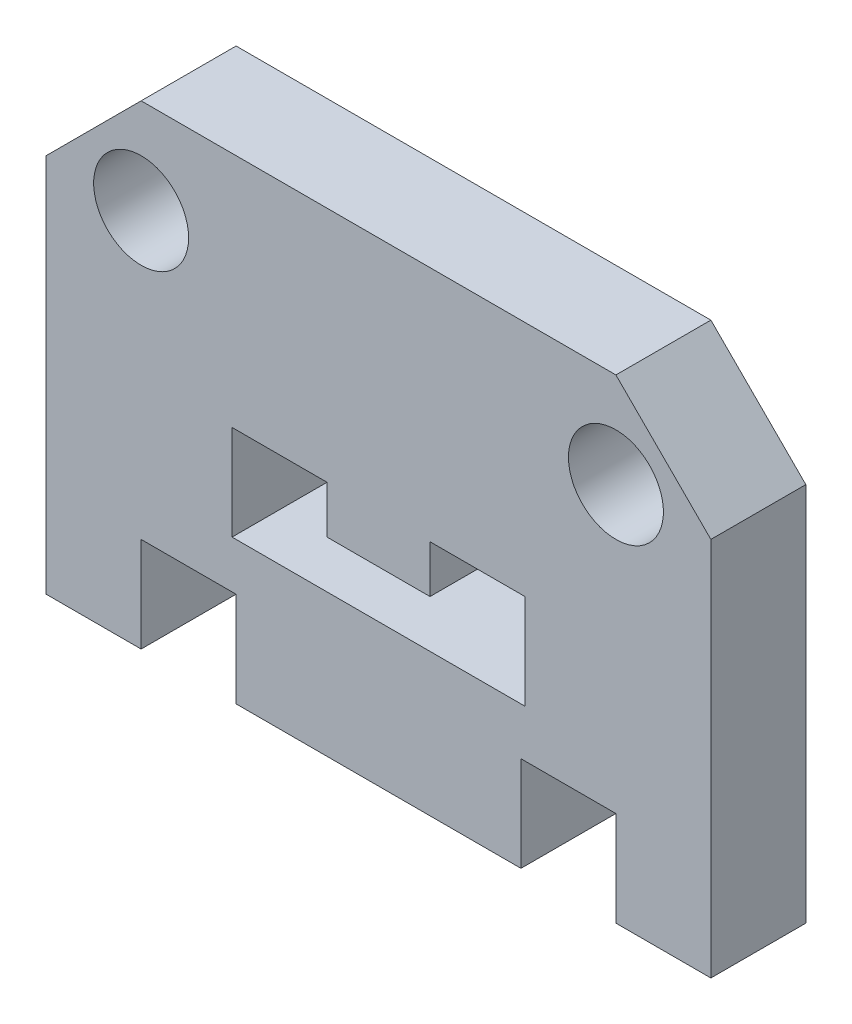
ISO-10303-21;
HEADER;
FILE_DESCRIPTION(('STEP AP214'),'2;1');
FILE_NAME('part.step','',(''),(''),'','','');
FILE_SCHEMA(('AUTOMOTIVE_DESIGN { 1 0 10303 214 1 1 1 1 }'));
ENDSEC;
DATA;
#1=APPLICATION_CONTEXT('core data for automotive mechanical design processes');
#2=APPLICATION_PROTOCOL_DEFINITION('international standard','automotive_design',2000,#1);
#3=PRODUCT_CONTEXT('',#1,'mechanical');
#4=PRODUCT('Part','Part','',(#3));
#5=PRODUCT_RELATED_PRODUCT_CATEGORY('part','',(#4));
#6=PRODUCT_DEFINITION_FORMATION('','',#4);
#7=PRODUCT_DEFINITION_CONTEXT('part definition',#1,'design');
#8=PRODUCT_DEFINITION('design','',#6,#7);
#9=PRODUCT_DEFINITION_SHAPE('','',#8);
#10=(LENGTH_UNIT() NAMED_UNIT(*) SI_UNIT(.MILLI.,.METRE.));
#11=(NAMED_UNIT(*) PLANE_ANGLE_UNIT() SI_UNIT($,.RADIAN.));
#12=(NAMED_UNIT(*) SI_UNIT($,.STERADIAN.) SOLID_ANGLE_UNIT());
#13=UNCERTAINTY_MEASURE_WITH_UNIT(LENGTH_MEASURE(1.E-05),#10,'distance_accuracy_value','');
#14=(GEOMETRIC_REPRESENTATION_CONTEXT(3) GLOBAL_UNCERTAINTY_ASSIGNED_CONTEXT((#13)) GLOBAL_UNIT_ASSIGNED_CONTEXT((#10,
#11,#12)) REPRESENTATION_CONTEXT('',''));
#15=CARTESIAN_POINT('',(0.,0.,0.));
#16=DIRECTION('',(0.,0.,1.));
#17=DIRECTION('',(1.,0.,0.));
#18=AXIS2_PLACEMENT_3D('',#15,#16,#17);
#19=CARTESIAN_POINT('',(0.,0.,10.));
#20=DIRECTION('',(0.,0.,1.));
#21=DIRECTION('',(1.,0.,0.));
#22=AXIS2_PLACEMENT_3D('',#19,#20,#21);
#23=PLANE('',#22);
#24=CARTESIAN_POINT('',(-25.,2.14457831325306,10.));
#25=DIRECTION('',(0.,0.,1.));
#26=DIRECTION('',(1.,0.,0.));
#27=AXIS2_PLACEMENT_3D('',#24,#25,#26);
#28=CIRCLE('',#27,5.);
#29=CARTESIAN_POINT('',(-20.,2.14457831325306,10.));
#30=VERTEX_POINT('',#29);
#31=EDGE_CURVE('E241',#30,#30,#28,.T.);
#32=ORIENTED_EDGE('',*,*,#31,.F.);
#33=EDGE_LOOP('',(#32));
#34=FACE_BOUND('',#33,.T.);
#35=DIRECTION('',(-0.707106781186548,-0.707106781186547,0.));
#36=VECTOR('',#35,1.);
#37=CARTESIAN_POINT('',(-25.,12.144578313253,10.));
#38=LINE('',#37,#36);
#39=CARTESIAN_POINT('',(-25.,12.144578313253,10.));
#40=VERTEX_POINT('',#39);
#41=CARTESIAN_POINT('',(-35.,2.14457831325301,10.));
#42=VERTEX_POINT('',#41);
#43=EDGE_CURVE('E285',#40,#42,#38,.T.);
#44=ORIENTED_EDGE('',*,*,#43,.T.);
#45=DIRECTION('',(0.,-1.,0.));
#46=VECTOR('',#45,1.);
#47=CARTESIAN_POINT('',(-35.,2.14457831325301,10.));
#48=LINE('',#47,#46);
#49=CARTESIAN_POINT('',(-35.,-37.855421686747,10.));
#50=VERTEX_POINT('',#49);
#51=EDGE_CURVE('E289',#42,#50,#48,.T.);
#52=ORIENTED_EDGE('',*,*,#51,.T.);
#53=DIRECTION('',(1.,0.,0.));
#54=VECTOR('',#53,1.);
#55=CARTESIAN_POINT('',(-35.,-37.855421686747,10.));
#56=LINE('',#55,#54);
#57=CARTESIAN_POINT('',(-25.,-37.855421686747,10.));
#58=VERTEX_POINT('',#57);
#59=EDGE_CURVE('E293',#50,#58,#56,.T.);
#60=ORIENTED_EDGE('',*,*,#59,.T.);
#61=DIRECTION('',(0.,1.,0.));
#62=VECTOR('',#61,1.);
#63=CARTESIAN_POINT('',(-25.,-37.855421686747,10.));
#64=LINE('',#63,#62);
#65=CARTESIAN_POINT('',(-25.,-27.855421686747,10.));
#66=VERTEX_POINT('',#65);
#67=EDGE_CURVE('E296',#58,#66,#64,.T.);
#68=ORIENTED_EDGE('',*,*,#67,.T.);
#69=DIRECTION('',(1.,0.,0.));
#70=VECTOR('',#69,1.);
#71=CARTESIAN_POINT('',(-25.,-27.855421686747,10.));
#72=LINE('',#71,#70);
#73=CARTESIAN_POINT('',(-15.,-27.855421686747,10.));
#74=VERTEX_POINT('',#73);
#75=EDGE_CURVE('E299',#66,#74,#72,.T.);
#76=ORIENTED_EDGE('',*,*,#75,.T.);
#77=DIRECTION('',(0.,-1.,0.));
#78=VECTOR('',#77,1.);
#79=CARTESIAN_POINT('',(-15.,-27.855421686747,10.));
#80=LINE('',#79,#78);
#81=CARTESIAN_POINT('',(-15.,-37.855421686747,10.));
#82=VERTEX_POINT('',#81);
#83=EDGE_CURVE('E302',#74,#82,#80,.T.);
#84=ORIENTED_EDGE('',*,*,#83,.T.);
#85=DIRECTION('',(1.,0.,0.));
#86=VECTOR('',#85,1.);
#87=CARTESIAN_POINT('',(-15.,-37.855421686747,10.));
#88=LINE('',#87,#86);
#89=CARTESIAN_POINT('',(15.,-37.855421686747,10.));
#90=VERTEX_POINT('',#89);
#91=EDGE_CURVE('E305',#82,#90,#88,.T.);
#92=ORIENTED_EDGE('',*,*,#91,.T.);
#93=DIRECTION('',(0.,1.,0.));
#94=VECTOR('',#93,1.);
#95=CARTESIAN_POINT('',(15.,-27.855421686747,10.));
#96=LINE('',#95,#94);
#97=CARTESIAN_POINT('',(15.,-27.855421686747,10.));
#98=VERTEX_POINT('',#97);
#99=EDGE_CURVE('E308',#90,#98,#96,.T.);
#100=ORIENTED_EDGE('',*,*,#99,.T.);
#101=DIRECTION('',(1.,0.,0.));
#102=VECTOR('',#101,1.);
#103=CARTESIAN_POINT('',(25.,-27.855421686747,10.));
#104=LINE('',#103,#102);
#105=CARTESIAN_POINT('',(25.,-27.855421686747,10.));
#106=VERTEX_POINT('',#105);
#107=EDGE_CURVE('E311',#98,#106,#104,.T.);
#108=ORIENTED_EDGE('',*,*,#107,.T.);
#109=DIRECTION('',(0.,-1.,0.));
#110=VECTOR('',#109,1.);
#111=CARTESIAN_POINT('',(25.,-37.855421686747,10.));
#112=LINE('',#111,#110);
#113=CARTESIAN_POINT('',(25.,-37.855421686747,10.));
#114=VERTEX_POINT('',#113);
#115=EDGE_CURVE('E314',#106,#114,#112,.T.);
#116=ORIENTED_EDGE('',*,*,#115,.T.);
#117=DIRECTION('',(1.,0.,0.));
#118=VECTOR('',#117,1.);
#119=CARTESIAN_POINT('',(35.,-37.855421686747,10.));
#120=LINE('',#119,#118);
#121=CARTESIAN_POINT('',(35.,-37.855421686747,10.));
#122=VERTEX_POINT('',#121);
#123=EDGE_CURVE('E317',#114,#122,#120,.T.);
#124=ORIENTED_EDGE('',*,*,#123,.T.);
#125=DIRECTION('',(0.,1.,0.));
#126=VECTOR('',#125,1.);
#127=CARTESIAN_POINT('',(35.,2.14457831325302,10.));
#128=LINE('',#127,#126);
#129=CARTESIAN_POINT('',(35.,2.14457831325302,10.));
#130=VERTEX_POINT('',#129);
#131=EDGE_CURVE('E320',#122,#130,#128,.T.);
#132=ORIENTED_EDGE('',*,*,#131,.T.);
#133=DIRECTION('',(-0.707106781186548,0.707106781186547,0.));
#134=VECTOR('',#133,1.);
#135=CARTESIAN_POINT('',(25.,12.144578313253,10.));
#136=LINE('',#135,#134);
#137=CARTESIAN_POINT('',(25.,12.144578313253,10.));
#138=VERTEX_POINT('',#137);
#139=EDGE_CURVE('E323',#130,#138,#136,.T.);
#140=ORIENTED_EDGE('',*,*,#139,.T.);
#141=DIRECTION('',(-1.,0.,0.));
#142=VECTOR('',#141,1.);
#143=CARTESIAN_POINT('',(25.,12.144578313253,10.));
#144=LINE('',#143,#142);
#145=EDGE_CURVE('E326',#138,#40,#144,.T.);
#146=ORIENTED_EDGE('',*,*,#145,.T.);
#147=EDGE_LOOP('',(#44,#52,#60,#68,#76,#84,#92,#100,#108,#116,#124,#132,#140,#146));
#148=FACE_BOUND('',#147,.T.);
#149=DIRECTION('',(0.,-1.,0.));
#150=VECTOR('',#149,1.);
#151=CARTESIAN_POINT('',(5.42168674698795,-17.855421686747,10.));
#152=LINE('',#151,#150);
#153=CARTESIAN_POINT('',(5.42168674698795,-12.855421686747,10.));
#154=VERTEX_POINT('',#153);
#155=CARTESIAN_POINT('',(5.42168674698795,-17.855421686747,10.));
#156=VERTEX_POINT('',#155);
#157=EDGE_CURVE('E202',#154,#156,#152,.T.);
#158=ORIENTED_EDGE('',*,*,#157,.F.);
#159=DIRECTION('',(-1.,0.,0.));
#160=VECTOR('',#159,1.);
#161=CARTESIAN_POINT('',(5.42168674698795,-12.855421686747,10.));
#162=LINE('',#161,#160);
#163=CARTESIAN_POINT('',(15.4216867469879,-12.855421686747,10.));
#164=VERTEX_POINT('',#163);
#165=EDGE_CURVE('E193',#164,#154,#162,.T.);
#166=ORIENTED_EDGE('',*,*,#165,.F.);
#167=DIRECTION('',(0.,1.,0.));
#168=VECTOR('',#167,1.);
#169=CARTESIAN_POINT('',(15.4216867469879,-12.855421686747,10.));
#170=LINE('',#169,#168);
#171=CARTESIAN_POINT('',(15.4216867469879,-22.855421686747,10.));
#172=VERTEX_POINT('',#171);
#173=EDGE_CURVE('E236',#172,#164,#170,.T.);
#174=ORIENTED_EDGE('',*,*,#173,.F.);
#175=DIRECTION('',(1.,0.,0.));
#176=VECTOR('',#175,1.);
#177=CARTESIAN_POINT('',(-15.4216867469879,-22.855421686747,10.));
#178=LINE('',#177,#176);
#179=CARTESIAN_POINT('',(-15.4216867469879,-22.855421686747,10.));
#180=VERTEX_POINT('',#179);
#181=EDGE_CURVE('E233',#180,#172,#178,.T.);
#182=ORIENTED_EDGE('',*,*,#181,.F.);
#183=DIRECTION('',(0.,-1.,0.));
#184=VECTOR('',#183,1.);
#185=CARTESIAN_POINT('',(-15.4216867469879,-12.855421686747,10.));
#186=LINE('',#185,#184);
#187=CARTESIAN_POINT('',(-15.4216867469879,-12.855421686747,10.));
#188=VERTEX_POINT('',#187);
#189=EDGE_CURVE('E230',#188,#180,#186,.T.);
#190=ORIENTED_EDGE('',*,*,#189,.F.);
#191=DIRECTION('',(-1.,0.,0.));
#192=VECTOR('',#191,1.);
#193=CARTESIAN_POINT('',(-5.42168674698794,-12.855421686747,10.));
#194=LINE('',#193,#192);
#195=CARTESIAN_POINT('',(-5.42168674698794,-12.855421686747,10.));
#196=VERTEX_POINT('',#195);
#197=EDGE_CURVE('E227',#196,#188,#194,.T.);
#198=ORIENTED_EDGE('',*,*,#197,.F.);
#199=DIRECTION('',(0.,1.,0.));
#200=VECTOR('',#199,1.);
#201=CARTESIAN_POINT('',(-5.42168674698794,-17.855421686747,10.));
#202=LINE('',#201,#200);
#203=CARTESIAN_POINT('',(-5.42168674698794,-17.855421686747,10.));
#204=VERTEX_POINT('',#203);
#205=EDGE_CURVE('E221',#204,#196,#202,.T.);
#206=ORIENTED_EDGE('',*,*,#205,.F.);
#207=DIRECTION('',(-1.,0.,0.));
#208=VECTOR('',#207,1.);
#209=CARTESIAN_POINT('',(5.42168674698795,-17.855421686747,10.));
#210=LINE('',#209,#208);
#211=EDGE_CURVE('E217',#156,#204,#210,.T.);
#212=ORIENTED_EDGE('',*,*,#211,.F.);
#213=EDGE_LOOP('',(#158,#166,#174,#182,#190,#198,#206,#212));
#214=FACE_BOUND('',#213,.T.);
#215=CARTESIAN_POINT('',(25.,2.14457831325307,10.));
#216=DIRECTION('',(0.,0.,1.));
#217=DIRECTION('',(-1.,0.,0.));
#218=AXIS2_PLACEMENT_3D('',#215,#216,#217);
#219=CIRCLE('',#218,5.);
#220=CARTESIAN_POINT('',(20.,2.14457831325307,10.));
#221=VERTEX_POINT('',#220);
#222=EDGE_CURVE('E768',#221,#221,#219,.T.);
#223=ORIENTED_EDGE('',*,*,#222,.F.);
#224=EDGE_LOOP('',(#223));
#225=FACE_BOUND('',#224,.T.);
#226=ADVANCED_FACE('F43',(#34,#148,#214,#225),#23,.T.);
#227=CARTESIAN_POINT('',(0.,0.,0.));
#228=DIRECTION('',(0.,0.,1.));
#229=DIRECTION('',(1.,0.,0.));
#230=AXIS2_PLACEMENT_3D('',#227,#228,#229);
#231=PLANE('',#230);
#232=DIRECTION('',(-0.707106781186548,-0.707106781186547,0.));
#233=VECTOR('',#232,1.);
#234=CARTESIAN_POINT('',(-25.,12.144578313253,0.));
#235=LINE('',#234,#233);
#236=CARTESIAN_POINT('',(-25.,12.144578313253,0.));
#237=VERTEX_POINT('',#236);
#238=CARTESIAN_POINT('',(-35.,2.14457831325301,0.));
#239=VERTEX_POINT('',#238);
#240=EDGE_CURVE('E211',#237,#239,#235,.T.);
#241=ORIENTED_EDGE('',*,*,#240,.F.);
#242=DIRECTION('',(-1.,0.,0.));
#243=VECTOR('',#242,1.);
#244=CARTESIAN_POINT('',(25.,12.144578313253,0.));
#245=LINE('',#244,#243);
#246=CARTESIAN_POINT('',(25.,12.144578313253,0.));
#247=VERTEX_POINT('',#246);
#248=EDGE_CURVE('E290',#247,#237,#245,.T.);
#249=ORIENTED_EDGE('',*,*,#248,.F.);
#250=DIRECTION('',(-0.707106781186548,0.707106781186547,0.));
#251=VECTOR('',#250,1.);
#252=CARTESIAN_POINT('',(25.,12.144578313253,0.));
#253=LINE('',#252,#251);
#254=CARTESIAN_POINT('',(35.,2.14457831325302,0.));
#255=VERTEX_POINT('',#254);
#256=EDGE_CURVE('E366',#255,#247,#253,.T.);
#257=ORIENTED_EDGE('',*,*,#256,.F.);
#258=DIRECTION('',(0.,1.,0.));
#259=VECTOR('',#258,1.);
#260=CARTESIAN_POINT('',(35.,2.14457831325302,0.));
#261=LINE('',#260,#259);
#262=CARTESIAN_POINT('',(35.,-37.855421686747,0.));
#263=VERTEX_POINT('',#262);
#264=EDGE_CURVE('E363',#263,#255,#261,.T.);
#265=ORIENTED_EDGE('',*,*,#264,.F.);
#266=DIRECTION('',(1.,0.,0.));
#267=VECTOR('',#266,1.);
#268=CARTESIAN_POINT('',(35.,-37.855421686747,0.));
#269=LINE('',#268,#267);
#270=CARTESIAN_POINT('',(25.,-37.855421686747,0.));
#271=VERTEX_POINT('',#270);
#272=EDGE_CURVE('E360',#271,#263,#269,.T.);
#273=ORIENTED_EDGE('',*,*,#272,.F.);
#274=DIRECTION('',(0.,-1.,0.));
#275=VECTOR('',#274,1.);
#276=CARTESIAN_POINT('',(25.,-37.855421686747,0.));
#277=LINE('',#276,#275);
#278=CARTESIAN_POINT('',(25.,-27.855421686747,0.));
#279=VERTEX_POINT('',#278);
#280=EDGE_CURVE('E357',#279,#271,#277,.T.);
#281=ORIENTED_EDGE('',*,*,#280,.F.);
#282=DIRECTION('',(1.,0.,0.));
#283=VECTOR('',#282,1.);
#284=CARTESIAN_POINT('',(25.,-27.855421686747,0.));
#285=LINE('',#284,#283);
#286=CARTESIAN_POINT('',(15.,-27.855421686747,0.));
#287=VERTEX_POINT('',#286);
#288=EDGE_CURVE('E354',#287,#279,#285,.T.);
#289=ORIENTED_EDGE('',*,*,#288,.F.);
#290=DIRECTION('',(0.,1.,0.));
#291=VECTOR('',#290,1.);
#292=CARTESIAN_POINT('',(15.,-27.855421686747,0.));
#293=LINE('',#292,#291);
#294=CARTESIAN_POINT('',(15.,-37.855421686747,0.));
#295=VERTEX_POINT('',#294);
#296=EDGE_CURVE('E351',#295,#287,#293,.T.);
#297=ORIENTED_EDGE('',*,*,#296,.F.);
#298=DIRECTION('',(1.,0.,0.));
#299=VECTOR('',#298,1.);
#300=CARTESIAN_POINT('',(-15.,-37.855421686747,0.));
#301=LINE('',#300,#299);
#302=CARTESIAN_POINT('',(-15.,-37.855421686747,0.));
#303=VERTEX_POINT('',#302);
#304=EDGE_CURVE('E348',#303,#295,#301,.T.);
#305=ORIENTED_EDGE('',*,*,#304,.F.);
#306=DIRECTION('',(0.,-1.,0.));
#307=VECTOR('',#306,1.);
#308=CARTESIAN_POINT('',(-15.,-27.855421686747,0.));
#309=LINE('',#308,#307);
#310=CARTESIAN_POINT('',(-15.,-27.855421686747,0.));
#311=VERTEX_POINT('',#310);
#312=EDGE_CURVE('E345',#311,#303,#309,.T.);
#313=ORIENTED_EDGE('',*,*,#312,.F.);
#314=DIRECTION('',(1.,0.,0.));
#315=VECTOR('',#314,1.);
#316=CARTESIAN_POINT('',(-25.,-27.855421686747,0.));
#317=LINE('',#316,#315);
#318=CARTESIAN_POINT('',(-25.,-27.855421686747,0.));
#319=VERTEX_POINT('',#318);
#320=EDGE_CURVE('E342',#319,#311,#317,.T.);
#321=ORIENTED_EDGE('',*,*,#320,.F.);
#322=DIRECTION('',(0.,1.,0.));
#323=VECTOR('',#322,1.);
#324=CARTESIAN_POINT('',(-25.,-37.855421686747,0.));
#325=LINE('',#324,#323);
#326=CARTESIAN_POINT('',(-25.,-37.855421686747,0.));
#327=VERTEX_POINT('',#326);
#328=EDGE_CURVE('E339',#327,#319,#325,.T.);
#329=ORIENTED_EDGE('',*,*,#328,.F.);
#330=DIRECTION('',(1.,0.,0.));
#331=VECTOR('',#330,1.);
#332=CARTESIAN_POINT('',(-35.,-37.855421686747,0.));
#333=LINE('',#332,#331);
#334=CARTESIAN_POINT('',(-35.,-37.855421686747,0.));
#335=VERTEX_POINT('',#334);
#336=EDGE_CURVE('E336',#335,#327,#333,.T.);
#337=ORIENTED_EDGE('',*,*,#336,.F.);
#338=DIRECTION('',(0.,-1.,0.));
#339=VECTOR('',#338,1.);
#340=CARTESIAN_POINT('',(-35.,2.14457831325301,0.));
#341=LINE('',#340,#339);
#342=EDGE_CURVE('E333',#239,#335,#341,.T.);
#343=ORIENTED_EDGE('',*,*,#342,.F.);
#344=EDGE_LOOP('',(#241,#249,#257,#265,#273,#281,#289,#297,#305,#313,#321,#329,#337,#343));
#345=FACE_BOUND('',#344,.T.);
#346=DIRECTION('',(-1.,0.,0.));
#347=VECTOR('',#346,1.);
#348=CARTESIAN_POINT('',(5.42168674698795,-12.855421686747,0.));
#349=LINE('',#348,#347);
#350=CARTESIAN_POINT('',(15.4216867469879,-12.855421686747,0.));
#351=VERTEX_POINT('',#350);
#352=CARTESIAN_POINT('',(5.42168674698795,-12.855421686747,0.));
#353=VERTEX_POINT('',#352);
#354=EDGE_CURVE('E67',#351,#353,#349,.T.);
#355=ORIENTED_EDGE('',*,*,#354,.T.);
#356=DIRECTION('',(0.,-1.,0.));
#357=VECTOR('',#356,1.);
#358=CARTESIAN_POINT('',(5.42168674698795,-17.855421686747,0.));
#359=LINE('',#358,#357);
#360=CARTESIAN_POINT('',(5.42168674698795,-17.855421686747,0.));
#361=VERTEX_POINT('',#360);
#362=EDGE_CURVE('E209',#353,#361,#359,.T.);
#363=ORIENTED_EDGE('',*,*,#362,.T.);
#364=DIRECTION('',(-1.,0.,0.));
#365=VECTOR('',#364,1.);
#366=CARTESIAN_POINT('',(5.42168674698795,-17.855421686747,0.));
#367=LINE('',#366,#365);
#368=CARTESIAN_POINT('',(-5.42168674698794,-17.855421686747,0.));
#369=VERTEX_POINT('',#368);
#370=EDGE_CURVE('E244',#361,#369,#367,.T.);
#371=ORIENTED_EDGE('',*,*,#370,.T.);
#372=DIRECTION('',(0.,1.,0.));
#373=VECTOR('',#372,1.);
#374=CARTESIAN_POINT('',(-5.42168674698794,-17.855421686747,0.));
#375=LINE('',#374,#373);
#376=CARTESIAN_POINT('',(-5.42168674698794,-12.855421686747,0.));
#377=VERTEX_POINT('',#376);
#378=EDGE_CURVE('E248',#369,#377,#375,.T.);
#379=ORIENTED_EDGE('',*,*,#378,.T.);
#380=DIRECTION('',(-1.,0.,0.));
#381=VECTOR('',#380,1.);
#382=CARTESIAN_POINT('',(-5.42168674698794,-12.855421686747,0.));
#383=LINE('',#382,#381);
#384=CARTESIAN_POINT('',(-15.4216867469879,-12.855421686747,0.));
#385=VERTEX_POINT('',#384);
#386=EDGE_CURVE('E252',#377,#385,#383,.T.);
#387=ORIENTED_EDGE('',*,*,#386,.T.);
#388=DIRECTION('',(0.,-1.,0.));
#389=VECTOR('',#388,1.);
#390=CARTESIAN_POINT('',(-15.4216867469879,-12.855421686747,0.));
#391=LINE('',#390,#389);
#392=CARTESIAN_POINT('',(-15.4216867469879,-22.855421686747,0.));
#393=VERTEX_POINT('',#392);
#394=EDGE_CURVE('E256',#385,#393,#391,.T.);
#395=ORIENTED_EDGE('',*,*,#394,.T.);
#396=DIRECTION('',(1.,0.,0.));
#397=VECTOR('',#396,1.);
#398=CARTESIAN_POINT('',(-15.4216867469879,-22.855421686747,0.));
#399=LINE('',#398,#397);
#400=CARTESIAN_POINT('',(15.4216867469879,-22.855421686747,0.));
#401=VERTEX_POINT('',#400);
#402=EDGE_CURVE('E260',#393,#401,#399,.T.);
#403=ORIENTED_EDGE('',*,*,#402,.T.);
#404=DIRECTION('',(0.,1.,0.));
#405=VECTOR('',#404,1.);
#406=CARTESIAN_POINT('',(15.4216867469879,-12.855421686747,0.));
#407=LINE('',#406,#405);
#408=EDGE_CURVE('E203',#401,#351,#407,.T.);
#409=ORIENTED_EDGE('',*,*,#408,.T.);
#410=EDGE_LOOP('',(#355,#363,#371,#379,#387,#395,#403,#409));
#411=FACE_BOUND('',#410,.T.);
#412=CARTESIAN_POINT('',(-25.,2.14457831325306,0.));
#413=DIRECTION('',(0.,0.,1.));
#414=DIRECTION('',(1.,0.,0.));
#415=AXIS2_PLACEMENT_3D('',#412,#413,#414);
#416=CIRCLE('',#415,5.);
#417=CARTESIAN_POINT('',(-20.,2.14457831325306,0.));
#418=VERTEX_POINT('',#417);
#419=EDGE_CURVE('E776',#418,#418,#416,.T.);
#420=ORIENTED_EDGE('',*,*,#419,.T.);
#421=EDGE_LOOP('',(#420));
#422=FACE_BOUND('',#421,.T.);
#423=CARTESIAN_POINT('',(25.,2.14457831325307,0.));
#424=DIRECTION('',(0.,0.,1.));
#425=DIRECTION('',(-1.,0.,0.));
#426=AXIS2_PLACEMENT_3D('',#423,#424,#425);
#427=CIRCLE('',#426,5.);
#428=CARTESIAN_POINT('',(20.,2.14457831325307,0.));
#429=VERTEX_POINT('',#428);
#430=EDGE_CURVE('E771',#429,#429,#427,.T.);
#431=ORIENTED_EDGE('',*,*,#430,.T.);
#432=EDGE_LOOP('',(#431));
#433=FACE_BOUND('',#432,.T.);
#434=ADVANCED_FACE('F429',(#345,#411,#422,#433),#231,.F.);
#435=CARTESIAN_POINT('',(-25.,12.144578313253,10.));
#436=DIRECTION('',(0.707106781186547,-0.707106781186548,0.));
#437=DIRECTION('',(0.707106781186548,0.707106781186547,0.));
#438=AXIS2_PLACEMENT_3D('',#435,#436,#437);
#439=PLANE('',#438);
#440=ORIENTED_EDGE('',*,*,#240,.T.);
#441=DIRECTION('',(0.,0.,-1.));
#442=VECTOR('',#441,1.);
#443=CARTESIAN_POINT('',(-35.,2.14457831325301,10.));
#444=LINE('',#443,#442);
#445=EDGE_CURVE('E11',#42,#239,#444,.T.);
#446=ORIENTED_EDGE('',*,*,#445,.F.);
#447=ORIENTED_EDGE('',*,*,#43,.F.);
#448=DIRECTION('',(0.,0.,-1.));
#449=VECTOR('',#448,1.);
#450=CARTESIAN_POINT('',(-25.,12.144578313253,10.));
#451=LINE('',#450,#449);
#452=EDGE_CURVE('E329',#40,#237,#451,.T.);
#453=ORIENTED_EDGE('',*,*,#452,.T.);
#454=EDGE_LOOP('',(#440,#446,#447,#453));
#455=FACE_BOUND('',#454,.T.);
#456=ADVANCED_FACE('F45',(#455),#439,.F.);
#457=CARTESIAN_POINT('',(-35.,2.14457831325301,10.));
#458=DIRECTION('',(1.,0.,0.));
#459=DIRECTION('',(0.,0.,-1.));
#460=AXIS2_PLACEMENT_3D('',#457,#458,#459);
#461=PLANE('',#460);
#462=ORIENTED_EDGE('',*,*,#342,.T.);
#463=DIRECTION('',(0.,0.,-1.));
#464=VECTOR('',#463,1.);
#465=CARTESIAN_POINT('',(-35.,-37.855421686747,10.));
#466=LINE('',#465,#464);
#467=EDGE_CURVE('E52',#50,#335,#466,.T.);
#468=ORIENTED_EDGE('',*,*,#467,.F.);
#469=ORIENTED_EDGE('',*,*,#51,.F.);
#470=ORIENTED_EDGE('',*,*,#445,.T.);
#471=EDGE_LOOP('',(#462,#468,#469,#470));
#472=FACE_BOUND('',#471,.T.);
#473=ADVANCED_FACE('F446',(#472),#461,.F.);
#474=CARTESIAN_POINT('',(-35.,-37.855421686747,10.));
#475=DIRECTION('',(0.,1.,0.));
#476=DIRECTION('',(-1.,0.,0.));
#477=AXIS2_PLACEMENT_3D('',#474,#475,#476);
#478=PLANE('',#477);
#479=ORIENTED_EDGE('',*,*,#336,.T.);
#480=DIRECTION('',(0.,0.,-1.));
#481=VECTOR('',#480,1.);
#482=CARTESIAN_POINT('',(-25.,-37.855421686747,10.));
#483=LINE('',#482,#481);
#484=EDGE_CURVE('E414',#58,#327,#483,.T.);
#485=ORIENTED_EDGE('',*,*,#484,.F.);
#486=ORIENTED_EDGE('',*,*,#59,.F.);
#487=ORIENTED_EDGE('',*,*,#467,.T.);
#488=EDGE_LOOP('',(#479,#485,#486,#487));
#489=FACE_BOUND('',#488,.T.);
#490=ADVANCED_FACE('F423',(#489),#478,.F.);
#491=CARTESIAN_POINT('',(-25.,-37.855421686747,10.));
#492=DIRECTION('',(-1.,0.,0.));
#493=DIRECTION('',(0.,0.,1.));
#494=AXIS2_PLACEMENT_3D('',#491,#492,#493);
#495=PLANE('',#494);
#496=ORIENTED_EDGE('',*,*,#328,.T.);
#497=DIRECTION('',(0.,0.,-1.));
#498=VECTOR('',#497,1.);
#499=CARTESIAN_POINT('',(-25.,-27.855421686747,10.));
#500=LINE('',#499,#498);
#501=EDGE_CURVE('E410',#66,#319,#500,.T.);
#502=ORIENTED_EDGE('',*,*,#501,.F.);
#503=ORIENTED_EDGE('',*,*,#67,.F.);
#504=ORIENTED_EDGE('',*,*,#484,.T.);
#505=EDGE_LOOP('',(#496,#502,#503,#504));
#506=FACE_BOUND('',#505,.T.);
#507=ADVANCED_FACE('F435',(#506),#495,.F.);
#508=CARTESIAN_POINT('',(-25.,-27.855421686747,10.));
#509=DIRECTION('',(0.,1.,0.));
#510=DIRECTION('',(0.,0.,1.));
#511=AXIS2_PLACEMENT_3D('',#508,#509,#510);
#512=PLANE('',#511);
#513=ORIENTED_EDGE('',*,*,#320,.T.);
#514=DIRECTION('',(0.,0.,-1.));
#515=VECTOR('',#514,1.);
#516=CARTESIAN_POINT('',(-15.,-27.855421686747,10.));
#517=LINE('',#516,#515);
#518=EDGE_CURVE('E406',#74,#311,#517,.T.);
#519=ORIENTED_EDGE('',*,*,#518,.F.);
#520=ORIENTED_EDGE('',*,*,#75,.F.);
#521=ORIENTED_EDGE('',*,*,#501,.T.);
#522=EDGE_LOOP('',(#513,#519,#520,#521));
#523=FACE_BOUND('',#522,.T.);
#524=ADVANCED_FACE('F439',(#523),#512,.F.);
#525=CARTESIAN_POINT('',(-15.,-27.855421686747,10.));
#526=DIRECTION('',(1.,0.,0.));
#527=DIRECTION('',(0.,1.,0.));
#528=AXIS2_PLACEMENT_3D('',#525,#526,#527);
#529=PLANE('',#528);
#530=ORIENTED_EDGE('',*,*,#312,.T.);
#531=DIRECTION('',(0.,0.,-1.));
#532=VECTOR('',#531,1.);
#533=CARTESIAN_POINT('',(-15.,-37.855421686747,10.));
#534=LINE('',#533,#532);
#535=EDGE_CURVE('E402',#82,#303,#534,.T.);
#536=ORIENTED_EDGE('',*,*,#535,.F.);
#537=ORIENTED_EDGE('',*,*,#83,.F.);
#538=ORIENTED_EDGE('',*,*,#518,.T.);
#539=EDGE_LOOP('',(#530,#536,#537,#538));
#540=FACE_BOUND('',#539,.T.);
#541=ADVANCED_FACE('F489',(#540),#529,.F.);
#542=CARTESIAN_POINT('',(-15.,-37.855421686747,10.));
#543=DIRECTION('',(0.,1.,0.));
#544=DIRECTION('',(-1.,0.,0.));
#545=AXIS2_PLACEMENT_3D('',#542,#543,#544);
#546=PLANE('',#545);
#547=ORIENTED_EDGE('',*,*,#304,.T.);
#548=DIRECTION('',(0.,0.,-1.));
#549=VECTOR('',#548,1.);
#550=CARTESIAN_POINT('',(15.,-37.855421686747,10.));
#551=LINE('',#550,#549);
#552=EDGE_CURVE('E398',#90,#295,#551,.T.);
#553=ORIENTED_EDGE('',*,*,#552,.F.);
#554=ORIENTED_EDGE('',*,*,#91,.F.);
#555=ORIENTED_EDGE('',*,*,#535,.T.);
#556=EDGE_LOOP('',(#547,#553,#554,#555));
#557=FACE_BOUND('',#556,.T.);
#558=ADVANCED_FACE('F487',(#557),#546,.F.);
#559=CARTESIAN_POINT('',(15.,-27.855421686747,10.));
#560=DIRECTION('',(-1.,0.,0.));
#561=DIRECTION('',(0.,-1.,0.));
#562=AXIS2_PLACEMENT_3D('',#559,#560,#561);
#563=PLANE('',#562);
#564=ORIENTED_EDGE('',*,*,#296,.T.);
#565=DIRECTION('',(0.,0.,-1.));
#566=VECTOR('',#565,1.);
#567=CARTESIAN_POINT('',(15.,-27.855421686747,10.));
#568=LINE('',#567,#566);
#569=EDGE_CURVE('E394',#98,#287,#568,.T.);
#570=ORIENTED_EDGE('',*,*,#569,.F.);
#571=ORIENTED_EDGE('',*,*,#99,.F.);
#572=ORIENTED_EDGE('',*,*,#552,.T.);
#573=EDGE_LOOP('',(#564,#570,#571,#572));
#574=FACE_BOUND('',#573,.T.);
#575=ADVANCED_FACE('F482',(#574),#563,.F.);
#576=CARTESIAN_POINT('',(25.,-27.855421686747,10.));
#577=DIRECTION('',(0.,1.,0.));
#578=DIRECTION('',(-1.,0.,0.));
#579=AXIS2_PLACEMENT_3D('',#576,#577,#578);
#580=PLANE('',#579);
#581=ORIENTED_EDGE('',*,*,#288,.T.);
#582=DIRECTION('',(0.,0.,-1.));
#583=VECTOR('',#582,1.);
#584=CARTESIAN_POINT('',(25.,-27.855421686747,10.));
#585=LINE('',#584,#583);
#586=EDGE_CURVE('E390',#106,#279,#585,.T.);
#587=ORIENTED_EDGE('',*,*,#586,.F.);
#588=ORIENTED_EDGE('',*,*,#107,.F.);
#589=ORIENTED_EDGE('',*,*,#569,.T.);
#590=EDGE_LOOP('',(#581,#587,#588,#589));
#591=FACE_BOUND('',#590,.T.);
#592=ADVANCED_FACE('F477',(#591),#580,.F.);
#593=CARTESIAN_POINT('',(25.,-37.855421686747,10.));
#594=DIRECTION('',(1.,0.,0.));
#595=DIRECTION('',(0.,1.,0.));
#596=AXIS2_PLACEMENT_3D('',#593,#594,#595);
#597=PLANE('',#596);
#598=ORIENTED_EDGE('',*,*,#280,.T.);
#599=DIRECTION('',(0.,0.,-1.));
#600=VECTOR('',#599,1.);
#601=CARTESIAN_POINT('',(25.,-37.855421686747,10.));
#602=LINE('',#601,#600);
#603=EDGE_CURVE('E386',#114,#271,#602,.T.);
#604=ORIENTED_EDGE('',*,*,#603,.F.);
#605=ORIENTED_EDGE('',*,*,#115,.F.);
#606=ORIENTED_EDGE('',*,*,#586,.T.);
#607=EDGE_LOOP('',(#598,#604,#605,#606));
#608=FACE_BOUND('',#607,.T.);
#609=ADVANCED_FACE('F473',(#608),#597,.F.);
#610=CARTESIAN_POINT('',(35.,-37.855421686747,10.));
#611=DIRECTION('',(0.,1.,0.));
#612=DIRECTION('',(-1.,0.,0.));
#613=AXIS2_PLACEMENT_3D('',#610,#611,#612);
#614=PLANE('',#613);
#615=ORIENTED_EDGE('',*,*,#272,.T.);
#616=DIRECTION('',(0.,0.,-1.));
#617=VECTOR('',#616,1.);
#618=CARTESIAN_POINT('',(35.,-37.855421686747,10.));
#619=LINE('',#618,#617);
#620=EDGE_CURVE('E382',#122,#263,#619,.T.);
#621=ORIENTED_EDGE('',*,*,#620,.F.);
#622=ORIENTED_EDGE('',*,*,#123,.F.);
#623=ORIENTED_EDGE('',*,*,#603,.T.);
#624=EDGE_LOOP('',(#615,#621,#622,#623));
#625=FACE_BOUND('',#624,.T.);
#626=ADVANCED_FACE('F468',(#625),#614,.F.);
#627=CARTESIAN_POINT('',(35.,2.14457831325302,10.));
#628=DIRECTION('',(-1.,0.,0.));
#629=DIRECTION('',(0.,-1.,0.));
#630=AXIS2_PLACEMENT_3D('',#627,#628,#629);
#631=PLANE('',#630);
#632=ORIENTED_EDGE('',*,*,#264,.T.);
#633=DIRECTION('',(0.,0.,-1.));
#634=VECTOR('',#633,1.);
#635=CARTESIAN_POINT('',(35.,2.14457831325302,10.));
#636=LINE('',#635,#634);
#637=EDGE_CURVE('E378',#130,#255,#636,.T.);
#638=ORIENTED_EDGE('',*,*,#637,.F.);
#639=ORIENTED_EDGE('',*,*,#131,.F.);
#640=ORIENTED_EDGE('',*,*,#620,.T.);
#641=EDGE_LOOP('',(#632,#638,#639,#640));
#642=FACE_BOUND('',#641,.T.);
#643=ADVANCED_FACE('F462',(#642),#631,.F.);
#644=CARTESIAN_POINT('',(25.,12.144578313253,10.));
#645=DIRECTION('',(-0.707106781186547,-0.707106781186548,0.));
#646=DIRECTION('',(0.707106781186548,-0.707106781186547,0.));
#647=AXIS2_PLACEMENT_3D('',#644,#645,#646);
#648=PLANE('',#647);
#649=ORIENTED_EDGE('',*,*,#256,.T.);
#650=DIRECTION('',(0.,0.,-1.));
#651=VECTOR('',#650,1.);
#652=CARTESIAN_POINT('',(25.,12.144578313253,10.));
#653=LINE('',#652,#651);
#654=EDGE_CURVE('E374',#138,#247,#653,.T.);
#655=ORIENTED_EDGE('',*,*,#654,.F.);
#656=ORIENTED_EDGE('',*,*,#139,.F.);
#657=ORIENTED_EDGE('',*,*,#637,.T.);
#658=EDGE_LOOP('',(#649,#655,#656,#657));
#659=FACE_BOUND('',#658,.T.);
#660=ADVANCED_FACE('F458',(#659),#648,.F.);
#661=CARTESIAN_POINT('',(25.,12.144578313253,10.));
#662=DIRECTION('',(0.,-1.,0.));
#663=DIRECTION('',(1.,0.,0.));
#664=AXIS2_PLACEMENT_3D('',#661,#662,#663);
#665=PLANE('',#664);
#666=ORIENTED_EDGE('',*,*,#248,.T.);
#667=ORIENTED_EDGE('',*,*,#452,.F.);
#668=ORIENTED_EDGE('',*,*,#145,.F.);
#669=ORIENTED_EDGE('',*,*,#654,.T.);
#670=EDGE_LOOP('',(#666,#667,#668,#669));
#671=FACE_BOUND('',#670,.T.);
#672=ADVANCED_FACE('F453',(#671),#665,.F.);
#673=CARTESIAN_POINT('',(5.42168674698795,-12.855421686747,10.));
#674=DIRECTION('',(0.,-1.,0.));
#675=DIRECTION('',(1.,0.,0.));
#676=AXIS2_PLACEMENT_3D('',#673,#674,#675);
#677=PLANE('',#676);
#678=ORIENTED_EDGE('',*,*,#354,.F.);
#679=DIRECTION('',(0.,0.,-1.));
#680=VECTOR('',#679,1.);
#681=CARTESIAN_POINT('',(15.4216867469879,-12.855421686747,10.));
#682=LINE('',#681,#680);
#683=EDGE_CURVE('E197',#164,#351,#682,.T.);
#684=ORIENTED_EDGE('',*,*,#683,.F.);
#685=ORIENTED_EDGE('',*,*,#165,.T.);
#686=DIRECTION('',(0.,0.,-1.));
#687=VECTOR('',#686,1.);
#688=CARTESIAN_POINT('',(5.42168674698795,-12.855421686747,10.));
#689=LINE('',#688,#687);
#690=EDGE_CURVE('E196',#154,#353,#689,.T.);
#691=ORIENTED_EDGE('',*,*,#690,.T.);
#692=EDGE_LOOP('',(#678,#684,#685,#691));
#693=FACE_BOUND('',#692,.T.);
#694=ADVANCED_FACE('F195',(#693),#677,.T.);
#695=CARTESIAN_POINT('',(5.42168674698795,-17.855421686747,10.));
#696=DIRECTION('',(1.,0.,0.));
#697=DIRECTION('',(0.,1.,0.));
#698=AXIS2_PLACEMENT_3D('',#695,#696,#697);
#699=PLANE('',#698);
#700=ORIENTED_EDGE('',*,*,#362,.F.);
#701=ORIENTED_EDGE('',*,*,#690,.F.);
#702=ORIENTED_EDGE('',*,*,#157,.T.);
#703=DIRECTION('',(0.,0.,-1.));
#704=VECTOR('',#703,1.);
#705=CARTESIAN_POINT('',(5.42168674698795,-17.855421686747,10.));
#706=LINE('',#705,#704);
#707=EDGE_CURVE('E212',#156,#361,#706,.T.);
#708=ORIENTED_EDGE('',*,*,#707,.T.);
#709=EDGE_LOOP('',(#700,#701,#702,#708));
#710=FACE_BOUND('',#709,.T.);
#711=ADVANCED_FACE('F206',(#710),#699,.T.);
#712=CARTESIAN_POINT('',(5.42168674698795,-17.855421686747,10.));
#713=DIRECTION('',(0.,-1.,0.));
#714=DIRECTION('',(1.,0.,0.));
#715=AXIS2_PLACEMENT_3D('',#712,#713,#714);
#716=PLANE('',#715);
#717=ORIENTED_EDGE('',*,*,#370,.F.);
#718=ORIENTED_EDGE('',*,*,#707,.F.);
#719=ORIENTED_EDGE('',*,*,#211,.T.);
#720=DIRECTION('',(0.,0.,-1.));
#721=VECTOR('',#720,1.);
#722=CARTESIAN_POINT('',(-5.42168674698794,-17.855421686747,10.));
#723=LINE('',#722,#721);
#724=EDGE_CURVE('E280',#204,#369,#723,.T.);
#725=ORIENTED_EDGE('',*,*,#724,.T.);
#726=EDGE_LOOP('',(#717,#718,#719,#725));
#727=FACE_BOUND('',#726,.T.);
#728=ADVANCED_FACE('F561',(#727),#716,.T.);
#729=CARTESIAN_POINT('',(-5.42168674698794,-17.855421686747,10.));
#730=DIRECTION('',(-1.,0.,0.));
#731=DIRECTION('',(0.,-1.,0.));
#732=AXIS2_PLACEMENT_3D('',#729,#730,#731);
#733=PLANE('',#732);
#734=ORIENTED_EDGE('',*,*,#378,.F.);
#735=ORIENTED_EDGE('',*,*,#724,.F.);
#736=ORIENTED_EDGE('',*,*,#205,.T.);
#737=DIRECTION('',(0.,0.,-1.));
#738=VECTOR('',#737,1.);
#739=CARTESIAN_POINT('',(-5.42168674698794,-12.855421686747,10.));
#740=LINE('',#739,#738);
#741=EDGE_CURVE('E277',#196,#377,#740,.T.);
#742=ORIENTED_EDGE('',*,*,#741,.T.);
#743=EDGE_LOOP('',(#734,#735,#736,#742));
#744=FACE_BOUND('',#743,.T.);
#745=ADVANCED_FACE('F567',(#744),#733,.T.);
#746=CARTESIAN_POINT('',(-5.42168674698794,-12.855421686747,10.));
#747=DIRECTION('',(0.,-1.,0.));
#748=DIRECTION('',(1.,0.,0.));
#749=AXIS2_PLACEMENT_3D('',#746,#747,#748);
#750=PLANE('',#749);
#751=ORIENTED_EDGE('',*,*,#386,.F.);
#752=ORIENTED_EDGE('',*,*,#741,.F.);
#753=ORIENTED_EDGE('',*,*,#197,.T.);
#754=DIRECTION('',(0.,0.,-1.));
#755=VECTOR('',#754,1.);
#756=CARTESIAN_POINT('',(-15.4216867469879,-12.855421686747,10.));
#757=LINE('',#756,#755);
#758=EDGE_CURVE('E274',#188,#385,#757,.T.);
#759=ORIENTED_EDGE('',*,*,#758,.T.);
#760=EDGE_LOOP('',(#751,#752,#753,#759));
#761=FACE_BOUND('',#760,.T.);
#762=ADVANCED_FACE('F575',(#761),#750,.T.);
#763=CARTESIAN_POINT('',(-15.4216867469879,-12.855421686747,10.));
#764=DIRECTION('',(1.,0.,0.));
#765=DIRECTION('',(0.,1.,0.));
#766=AXIS2_PLACEMENT_3D('',#763,#764,#765);
#767=PLANE('',#766);
#768=ORIENTED_EDGE('',*,*,#394,.F.);
#769=ORIENTED_EDGE('',*,*,#758,.F.);
#770=ORIENTED_EDGE('',*,*,#189,.T.);
#771=DIRECTION('',(0.,0.,-1.));
#772=VECTOR('',#771,1.);
#773=CARTESIAN_POINT('',(-15.4216867469879,-22.855421686747,10.));
#774=LINE('',#773,#772);
#775=EDGE_CURVE('E271',#180,#393,#774,.T.);
#776=ORIENTED_EDGE('',*,*,#775,.T.);
#777=EDGE_LOOP('',(#768,#769,#770,#776));
#778=FACE_BOUND('',#777,.T.);
#779=ADVANCED_FACE('F583',(#778),#767,.T.);
#780=CARTESIAN_POINT('',(-15.4216867469879,-22.855421686747,10.));
#781=DIRECTION('',(0.,1.,0.));
#782=DIRECTION('',(-1.,0.,0.));
#783=AXIS2_PLACEMENT_3D('',#780,#781,#782);
#784=PLANE('',#783);
#785=ORIENTED_EDGE('',*,*,#402,.F.);
#786=ORIENTED_EDGE('',*,*,#775,.F.);
#787=ORIENTED_EDGE('',*,*,#181,.T.);
#788=DIRECTION('',(0.,0.,-1.));
#789=VECTOR('',#788,1.);
#790=CARTESIAN_POINT('',(15.4216867469879,-22.855421686747,10.));
#791=LINE('',#790,#789);
#792=EDGE_CURVE('E59',#172,#401,#791,.T.);
#793=ORIENTED_EDGE('',*,*,#792,.T.);
#794=EDGE_LOOP('',(#785,#786,#787,#793));
#795=FACE_BOUND('',#794,.T.);
#796=ADVANCED_FACE('F591',(#795),#784,.T.);
#797=CARTESIAN_POINT('',(15.4216867469879,-12.855421686747,10.));
#798=DIRECTION('',(-1.,0.,0.));
#799=DIRECTION('',(0.,-1.,0.));
#800=AXIS2_PLACEMENT_3D('',#797,#798,#799);
#801=PLANE('',#800);
#802=ORIENTED_EDGE('',*,*,#408,.F.);
#803=ORIENTED_EDGE('',*,*,#792,.F.);
#804=ORIENTED_EDGE('',*,*,#173,.T.);
#805=ORIENTED_EDGE('',*,*,#683,.T.);
#806=EDGE_LOOP('',(#802,#803,#804,#805));
#807=FACE_BOUND('',#806,.T.);
#808=ADVANCED_FACE('F599',(#807),#801,.T.);
#809=CARTESIAN_POINT('',(-25.,2.14457831325306,10.));
#810=DIRECTION('',(0.,0.,-1.));
#811=DIRECTION('',(-1.,0.,0.));
#812=AXIS2_PLACEMENT_3D('',#809,#810,#811);
#813=CYLINDRICAL_SURFACE('',#812,5.);
#814=ORIENTED_EDGE('',*,*,#31,.T.);
#815=EDGE_LOOP('',(#814));
#816=FACE_BOUND('',#815,.T.);
#817=ORIENTED_EDGE('',*,*,#419,.F.);
#818=EDGE_LOOP('',(#817));
#819=FACE_BOUND('',#818,.T.);
#820=ADVANCED_FACE('F607',(#816,#819),#813,.F.);
#821=CARTESIAN_POINT('',(25.,2.14457831325307,10.));
#822=DIRECTION('',(0.,0.,-1.));
#823=DIRECTION('',(-1.,0.,0.));
#824=AXIS2_PLACEMENT_3D('',#821,#822,#823);
#825=CYLINDRICAL_SURFACE('',#824,5.);
#826=ORIENTED_EDGE('',*,*,#222,.T.);
#827=EDGE_LOOP('',(#826));
#828=FACE_BOUND('',#827,.T.);
#829=ORIENTED_EDGE('',*,*,#430,.F.);
#830=EDGE_LOOP('',(#829));
#831=FACE_BOUND('',#830,.T.);
#832=ADVANCED_FACE('F614',(#828,#831),#825,.F.);
#833=CLOSED_SHELL('',(#226,#434,#456,#473,#490,#507,#524,#541,#558,#575,#592,#609,#626,#643,
#660,#672,#694,#711,#728,#745,#762,#779,#796,#808,#820,#832));
#834=MANIFOLD_SOLID_BREP('B2',#833);
#835=ADVANCED_BREP_SHAPE_REPRESENTATION('',(#18,#834),#14);
#836=SHAPE_DEFINITION_REPRESENTATION(#9,#835);
ENDSEC;
END-ISO-10303-21;
